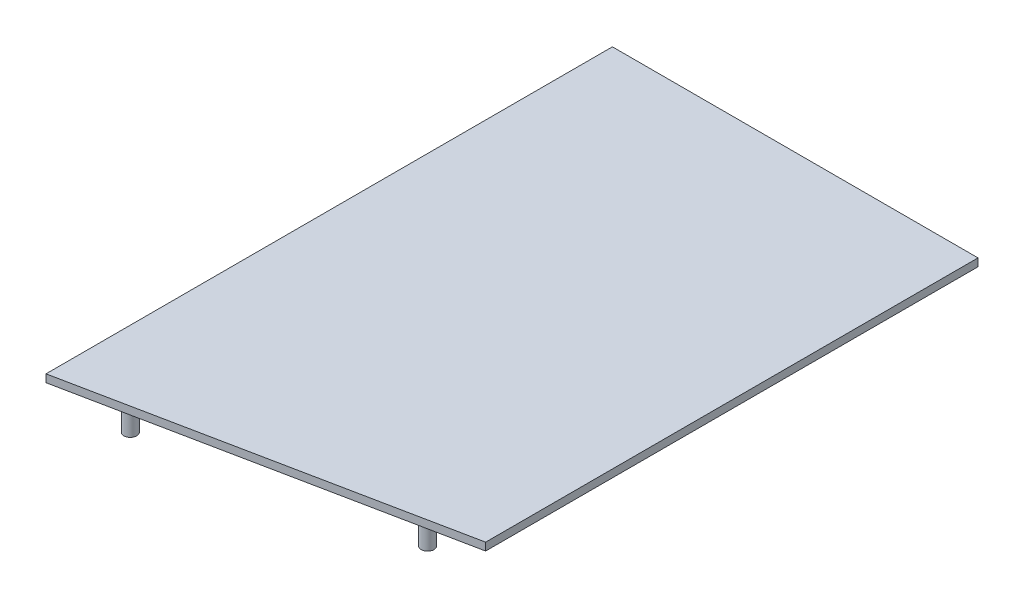
ISO-10303-21;
HEADER;
FILE_DESCRIPTION(('STEP AP214'),'2;1');
FILE_NAME('part.step','',(''),(''),'','','');
FILE_SCHEMA(('AUTOMOTIVE_DESIGN { 1 0 10303 214 1 1 1 1 }'));
ENDSEC;
DATA;
#1=APPLICATION_CONTEXT('core data for automotive mechanical design processes');
#2=APPLICATION_PROTOCOL_DEFINITION('international standard','automotive_design',2000,#1);
#3=PRODUCT_CONTEXT('',#1,'mechanical');
#4=PRODUCT('Part','Part','',(#3));
#5=PRODUCT_RELATED_PRODUCT_CATEGORY('part','',(#4));
#6=PRODUCT_DEFINITION_FORMATION('','',#4);
#7=PRODUCT_DEFINITION_CONTEXT('part definition',#1,'design');
#8=PRODUCT_DEFINITION('design','',#6,#7);
#9=PRODUCT_DEFINITION_SHAPE('','',#8);
#10=(LENGTH_UNIT() NAMED_UNIT(*) SI_UNIT(.MILLI.,.METRE.));
#11=(NAMED_UNIT(*) PLANE_ANGLE_UNIT() SI_UNIT($,.RADIAN.));
#12=(NAMED_UNIT(*) SI_UNIT($,.STERADIAN.) SOLID_ANGLE_UNIT());
#13=UNCERTAINTY_MEASURE_WITH_UNIT(LENGTH_MEASURE(1.E-05),#10,'distance_accuracy_value','');
#14=(GEOMETRIC_REPRESENTATION_CONTEXT(3) GLOBAL_UNCERTAINTY_ASSIGNED_CONTEXT((#13)) GLOBAL_UNIT_ASSIGNED_CONTEXT((#10,
#11,#12)) REPRESENTATION_CONTEXT('',''));
#15=CARTESIAN_POINT('',(0.,0.,0.));
#16=DIRECTION('',(0.,0.,1.));
#17=DIRECTION('',(1.,0.,0.));
#18=AXIS2_PLACEMENT_3D('',#15,#16,#17);
#19=CARTESIAN_POINT('',(0.,1.5,0.));
#20=DIRECTION('',(1.,0.,0.));
#21=DIRECTION('',(0.,0.,-1.));
#22=AXIS2_PLACEMENT_3D('',#19,#20,#21);
#23=PLANE('',#22);
#24=DIRECTION('',(0.,0.,1.));
#25=VECTOR('',#24,1.);
#26=CARTESIAN_POINT('',(0.,0.,0.));
#27=LINE('',#26,#25);
#28=CARTESIAN_POINT('',(0.,0.,-110.));
#29=VERTEX_POINT('',#28);
#30=CARTESIAN_POINT('',(0.,0.,0.));
#31=VERTEX_POINT('',#30);
#32=EDGE_CURVE('E181',#29,#31,#27,.T.);
#33=ORIENTED_EDGE('',*,*,#32,.T.);
#34=DIRECTION('',(0.,-1.,0.));
#35=VECTOR('',#34,1.);
#36=CARTESIAN_POINT('',(0.,1.5,0.));
#37=LINE('',#36,#35);
#38=CARTESIAN_POINT('',(0.,1.5,0.));
#39=VERTEX_POINT('',#38);
#40=EDGE_CURVE('E216',#39,#31,#37,.T.);
#41=ORIENTED_EDGE('',*,*,#40,.F.);
#42=DIRECTION('',(0.,0.,1.));
#43=VECTOR('',#42,1.);
#44=CARTESIAN_POINT('',(0.,1.5,0.));
#45=LINE('',#44,#43);
#46=CARTESIAN_POINT('',(0.,1.5,-110.));
#47=VERTEX_POINT('',#46);
#48=EDGE_CURVE('E190',#47,#39,#45,.T.);
#49=ORIENTED_EDGE('',*,*,#48,.F.);
#50=DIRECTION('',(0.,-1.,0.));
#51=VECTOR('',#50,1.);
#52=CARTESIAN_POINT('',(0.,1.5,-110.));
#53=LINE('',#52,#51);
#54=EDGE_CURVE('E200',#47,#29,#53,.T.);
#55=ORIENTED_EDGE('',*,*,#54,.T.);
#56=EDGE_LOOP('',(#33,#41,#49,#55));
#57=FACE_BOUND('',#56,.T.);
#58=ADVANCED_FACE('F33',(#57),#23,.F.);
#59=CARTESIAN_POINT('',(0.,1.5,0.));
#60=DIRECTION('',(-0.198504745678867,0.,-0.980099926509011));
#61=DIRECTION('',(-0.980099926509011,0.,0.198504745678867));
#62=AXIS2_PLACEMENT_3D('',#59,#60,#61);
#63=PLANE('',#62);
#64=DIRECTION('',(0.980099926509011,0.,-0.198504745678867));
#65=VECTOR('',#64,1.);
#66=CARTESIAN_POINT('',(0.,0.,0.));
#67=LINE('',#66,#65);
#68=CARTESIAN_POINT('',(71.,0.,-14.38));
#69=VERTEX_POINT('',#68);
#70=EDGE_CURVE('E203',#31,#69,#67,.T.);
#71=ORIENTED_EDGE('',*,*,#70,.T.);
#72=DIRECTION('',(0.,-1.,0.));
#73=VECTOR('',#72,1.);
#74=CARTESIAN_POINT('',(71.,1.5,-14.38));
#75=LINE('',#74,#73);
#76=CARTESIAN_POINT('',(71.,1.5,-14.38));
#77=VERTEX_POINT('',#76);
#78=EDGE_CURVE('E213',#77,#69,#75,.T.);
#79=ORIENTED_EDGE('',*,*,#78,.F.);
#80=DIRECTION('',(0.980099926509011,0.,-0.198504745678867));
#81=VECTOR('',#80,1.);
#82=CARTESIAN_POINT('',(0.,1.5,0.));
#83=LINE('',#82,#81);
#84=EDGE_CURVE('E193',#39,#77,#83,.T.);
#85=ORIENTED_EDGE('',*,*,#84,.F.);
#86=ORIENTED_EDGE('',*,*,#40,.T.);
#87=EDGE_LOOP('',(#71,#79,#85,#86));
#88=FACE_BOUND('',#87,.T.);
#89=ADVANCED_FACE('F256',(#88),#63,.F.);
#90=CARTESIAN_POINT('',(71.,1.5,-14.38));
#91=DIRECTION('',(-1.,0.,0.));
#92=DIRECTION('',(0.,0.,1.));
#93=AXIS2_PLACEMENT_3D('',#90,#91,#92);
#94=PLANE('',#93);
#95=DIRECTION('',(0.,0.,-1.));
#96=VECTOR('',#95,1.);
#97=CARTESIAN_POINT('',(71.,0.,-14.38));
#98=LINE('',#97,#96);
#99=CARTESIAN_POINT('',(71.,0.,-110.));
#100=VERTEX_POINT('',#99);
#101=EDGE_CURVE('E205',#69,#100,#98,.T.);
#102=ORIENTED_EDGE('',*,*,#101,.T.);
#103=DIRECTION('',(0.,-1.,0.));
#104=VECTOR('',#103,1.);
#105=CARTESIAN_POINT('',(71.,1.5,-110.));
#106=LINE('',#105,#104);
#107=CARTESIAN_POINT('',(71.,1.5,-110.));
#108=VERTEX_POINT('',#107);
#109=EDGE_CURVE('E210',#108,#100,#106,.T.);
#110=ORIENTED_EDGE('',*,*,#109,.F.);
#111=DIRECTION('',(0.,0.,-1.));
#112=VECTOR('',#111,1.);
#113=CARTESIAN_POINT('',(71.,1.5,-14.38));
#114=LINE('',#113,#112);
#115=EDGE_CURVE('E196',#77,#108,#114,.T.);
#116=ORIENTED_EDGE('',*,*,#115,.F.);
#117=ORIENTED_EDGE('',*,*,#78,.T.);
#118=EDGE_LOOP('',(#102,#110,#116,#117));
#119=FACE_BOUND('',#118,.T.);
#120=ADVANCED_FACE('F253',(#119),#94,.F.);
#121=CARTESIAN_POINT('',(0.,1.5,-110.));
#122=DIRECTION('',(0.,0.,1.));
#123=DIRECTION('',(1.,0.,0.));
#124=AXIS2_PLACEMENT_3D('',#121,#122,#123);
#125=PLANE('',#124);
#126=DIRECTION('',(-1.,0.,0.));
#127=VECTOR('',#126,1.);
#128=CARTESIAN_POINT('',(0.,0.,-110.));
#129=LINE('',#128,#127);
#130=EDGE_CURVE('E194',#100,#29,#129,.T.);
#131=ORIENTED_EDGE('',*,*,#130,.T.);
#132=ORIENTED_EDGE('',*,*,#54,.F.);
#133=DIRECTION('',(-1.,0.,0.));
#134=VECTOR('',#133,1.);
#135=CARTESIAN_POINT('',(0.,1.5,-110.));
#136=LINE('',#135,#134);
#137=EDGE_CURVE('E198',#108,#47,#136,.T.);
#138=ORIENTED_EDGE('',*,*,#137,.F.);
#139=ORIENTED_EDGE('',*,*,#109,.T.);
#140=EDGE_LOOP('',(#131,#132,#138,#139));
#141=FACE_BOUND('',#140,.T.);
#142=ADVANCED_FACE('F249',(#141),#125,.F.);
#143=CARTESIAN_POINT('',(0.,1.5,0.));
#144=DIRECTION('',(0.,-1.,0.));
#145=DIRECTION('',(0.,0.,-1.));
#146=AXIS2_PLACEMENT_3D('',#143,#144,#145);
#147=PLANE('',#146);
#148=ORIENTED_EDGE('',*,*,#48,.T.);
#149=ORIENTED_EDGE('',*,*,#84,.T.);
#150=ORIENTED_EDGE('',*,*,#115,.T.);
#151=ORIENTED_EDGE('',*,*,#137,.T.);
#152=EDGE_LOOP('',(#148,#149,#150,#151));
#153=FACE_BOUND('',#152,.T.);
#154=ADVANCED_FACE('F236',(#153),#147,.F.);
#155=CARTESIAN_POINT('',(0.,0.,0.));
#156=DIRECTION('',(0.,-1.,0.));
#157=DIRECTION('',(0.,0.,-1.));
#158=AXIS2_PLACEMENT_3D('',#155,#156,#157);
#159=PLANE('',#158);
#160=DIRECTION('',(1.,0.,0.));
#161=VECTOR('',#160,1.);
#162=CARTESIAN_POINT('',(66.,0.,-105.));
#163=LINE('',#162,#161);
#164=CARTESIAN_POINT('',(5.,0.,-105.));
#165=VERTEX_POINT('',#164);
#166=CARTESIAN_POINT('',(66.,0.,-105.));
#167=VERTEX_POINT('',#166);
#168=EDGE_CURVE('E47',#165,#167,#163,.T.);
#169=ORIENTED_EDGE('',*,*,#168,.F.);
#170=DIRECTION('',(0.,0.,-1.));
#171=VECTOR('',#170,1.);
#172=CARTESIAN_POINT('',(5.,0.,-6.11419669190154));
#173=LINE('',#172,#171);
#174=CARTESIAN_POINT('',(5.,0.,-6.11419669190154));
#175=VERTEX_POINT('',#174);
#176=EDGE_CURVE('E141',#175,#165,#173,.T.);
#177=ORIENTED_EDGE('',*,*,#176,.F.);
#178=DIRECTION('',(-0.980099926509011,0.,0.198504745678867));
#179=VECTOR('',#178,1.);
#180=CARTESIAN_POINT('',(66.,0.,-18.4688445792255));
#181=LINE('',#180,#179);
#182=CARTESIAN_POINT('',(66.,0.,-18.4688445792255));
#183=VERTEX_POINT('',#182);
#184=EDGE_CURVE('E144',#183,#175,#181,.T.);
#185=ORIENTED_EDGE('',*,*,#184,.F.);
#186=DIRECTION('',(0.,0.,1.));
#187=VECTOR('',#186,1.);
#188=CARTESIAN_POINT('',(66.,0.,-105.));
#189=LINE('',#188,#187);
#190=EDGE_CURVE('E150',#167,#183,#189,.T.);
#191=ORIENTED_EDGE('',*,*,#190,.F.);
#192=EDGE_LOOP('',(#169,#177,#185,#191));
#193=FACE_BOUND('',#192,.T.);
#194=CARTESIAN_POINT('',(59.5,0.,-14.6016053882043));
#195=DIRECTION('',(0.,-1.,0.));
#196=DIRECTION('',(0.,0.,-1.));
#197=AXIS2_PLACEMENT_3D('',#194,#195,#196);
#198=CIRCLE('',#197,1.25);
#199=CARTESIAN_POINT('',(59.5,0.,-13.3516053882043));
#200=VERTEX_POINT('',#199);
#201=EDGE_CURVE('E11',#200,#200,#198,.T.);
#202=ORIENTED_EDGE('',*,*,#201,.F.);
#203=EDGE_LOOP('',(#202));
#204=FACE_BOUND('',#203,.T.);
#205=CARTESIAN_POINT('',(11.5,0.,-4.87991524735922));
#206=DIRECTION('',(0.,-1.,0.));
#207=DIRECTION('',(0.,0.,-1.));
#208=AXIS2_PLACEMENT_3D('',#205,#206,#207);
#209=CIRCLE('',#208,1.25);
#210=CARTESIAN_POINT('',(11.5,0.,-3.62991524735922));
#211=VERTEX_POINT('',#210);
#212=EDGE_CURVE('E40',#211,#211,#209,.T.);
#213=ORIENTED_EDGE('',*,*,#212,.F.);
#214=EDGE_LOOP('',(#213));
#215=FACE_BOUND('',#214,.T.);
#216=DIRECTION('',(0.,0.,-1.));
#217=VECTOR('',#216,1.);
#218=CARTESIAN_POINT('',(10.,0.,0.));
#219=LINE('',#218,#217);
#220=CARTESIAN_POINT('',(10.,0.,-106.25));
#221=VERTEX_POINT('',#220);
#222=CARTESIAN_POINT('',(10.,0.,-108.75));
#223=VERTEX_POINT('',#222);
#224=EDGE_CURVE('E226',#221,#223,#219,.T.);
#225=ORIENTED_EDGE('',*,*,#224,.F.);
#226=DIRECTION('',(-1.,0.,0.));
#227=VECTOR('',#226,1.);
#228=CARTESIAN_POINT('',(0.,0.,-106.25));
#229=LINE('',#228,#227);
#230=CARTESIAN_POINT('',(12.5,0.,-106.25));
#231=VERTEX_POINT('',#230);
#232=EDGE_CURVE('E219',#231,#221,#229,.T.);
#233=ORIENTED_EDGE('',*,*,#232,.F.);
#234=DIRECTION('',(0.,0.,1.));
#235=VECTOR('',#234,1.);
#236=CARTESIAN_POINT('',(12.5,0.,0.));
#237=LINE('',#236,#235);
#238=CARTESIAN_POINT('',(12.5,0.,-108.75));
#239=VERTEX_POINT('',#238);
#240=EDGE_CURVE('E222',#239,#231,#237,.T.);
#241=ORIENTED_EDGE('',*,*,#240,.F.);
#242=DIRECTION('',(1.,0.,0.));
#243=VECTOR('',#242,1.);
#244=CARTESIAN_POINT('',(0.,0.,-108.75));
#245=LINE('',#244,#243);
#246=EDGE_CURVE('E55',#223,#239,#245,.T.);
#247=ORIENTED_EDGE('',*,*,#246,.F.);
#248=EDGE_LOOP('',(#225,#233,#241,#247));
#249=FACE_BOUND('',#248,.T.);
#250=ORIENTED_EDGE('',*,*,#32,.F.);
#251=ORIENTED_EDGE('',*,*,#130,.F.);
#252=ORIENTED_EDGE('',*,*,#101,.F.);
#253=ORIENTED_EDGE('',*,*,#70,.F.);
#254=EDGE_LOOP('',(#250,#251,#252,#253));
#255=FACE_BOUND('',#254,.T.);
#256=ADVANCED_FACE('F233',(#193,#204,#215,#249,#255),#159,.T.);
#257=CARTESIAN_POINT('',(10.,-5.,-108.75));
#258=DIRECTION('',(-1.,0.,0.));
#259=DIRECTION('',(0.,0.,1.));
#260=AXIS2_PLACEMENT_3D('',#257,#258,#259);
#261=PLANE('',#260);
#262=DIRECTION('',(0.,1.,0.));
#263=VECTOR('',#262,1.);
#264=CARTESIAN_POINT('',(10.,-5.,-106.25));
#265=LINE('',#264,#263);
#266=CARTESIAN_POINT('',(10.,-5.,-106.25));
#267=VERTEX_POINT('',#266);
#268=EDGE_CURVE('E177',#267,#221,#265,.T.);
#269=ORIENTED_EDGE('',*,*,#268,.T.);
#270=ORIENTED_EDGE('',*,*,#224,.T.);
#271=DIRECTION('',(0.,1.,0.));
#272=VECTOR('',#271,1.);
#273=CARTESIAN_POINT('',(10.,-5.,-108.75));
#274=LINE('',#273,#272);
#275=CARTESIAN_POINT('',(10.,-5.,-108.75));
#276=VERTEX_POINT('',#275);
#277=EDGE_CURVE('E178',#276,#223,#274,.T.);
#278=ORIENTED_EDGE('',*,*,#277,.F.);
#279=DIRECTION('',(0.,0.,1.));
#280=VECTOR('',#279,1.);
#281=CARTESIAN_POINT('',(10.,-5.,-108.75));
#282=LINE('',#281,#280);
#283=EDGE_CURVE('E165',#276,#267,#282,.T.);
#284=ORIENTED_EDGE('',*,*,#283,.T.);
#285=EDGE_LOOP('',(#269,#270,#278,#284));
#286=FACE_BOUND('',#285,.T.);
#287=ADVANCED_FACE('F235',(#286),#261,.T.);
#288=CARTESIAN_POINT('',(10.,-5.,-108.75));
#289=DIRECTION('',(0.,0.,-1.));
#290=DIRECTION('',(-1.,0.,0.));
#291=AXIS2_PLACEMENT_3D('',#288,#289,#290);
#292=PLANE('',#291);
#293=ORIENTED_EDGE('',*,*,#277,.T.);
#294=ORIENTED_EDGE('',*,*,#246,.T.);
#295=DIRECTION('',(0.,1.,0.));
#296=VECTOR('',#295,1.);
#297=CARTESIAN_POINT('',(12.5,-5.,-108.75));
#298=LINE('',#297,#296);
#299=CARTESIAN_POINT('',(12.5,-5.,-108.75));
#300=VERTEX_POINT('',#299);
#301=EDGE_CURVE('E182',#300,#239,#298,.T.);
#302=ORIENTED_EDGE('',*,*,#301,.F.);
#303=DIRECTION('',(-1.,0.,0.));
#304=VECTOR('',#303,1.);
#305=CARTESIAN_POINT('',(10.,-5.,-108.75));
#306=LINE('',#305,#304);
#307=EDGE_CURVE('E174',#300,#276,#306,.T.);
#308=ORIENTED_EDGE('',*,*,#307,.T.);
#309=EDGE_LOOP('',(#293,#294,#302,#308));
#310=FACE_BOUND('',#309,.T.);
#311=ADVANCED_FACE('F293',(#310),#292,.T.);
#312=CARTESIAN_POINT('',(12.5,-5.,-108.75));
#313=DIRECTION('',(1.,0.,0.));
#314=DIRECTION('',(0.,0.,-1.));
#315=AXIS2_PLACEMENT_3D('',#312,#313,#314);
#316=PLANE('',#315);
#317=ORIENTED_EDGE('',*,*,#301,.T.);
#318=ORIENTED_EDGE('',*,*,#240,.T.);
#319=DIRECTION('',(0.,1.,0.));
#320=VECTOR('',#319,1.);
#321=CARTESIAN_POINT('',(12.5,-5.,-106.25));
#322=LINE('',#321,#320);
#323=CARTESIAN_POINT('',(12.5,-5.,-106.25));
#324=VERTEX_POINT('',#323);
#325=EDGE_CURVE('E185',#324,#231,#322,.T.);
#326=ORIENTED_EDGE('',*,*,#325,.F.);
#327=DIRECTION('',(0.,0.,-1.));
#328=VECTOR('',#327,1.);
#329=CARTESIAN_POINT('',(12.5,-5.,-108.75));
#330=LINE('',#329,#328);
#331=EDGE_CURVE('E171',#324,#300,#330,.T.);
#332=ORIENTED_EDGE('',*,*,#331,.T.);
#333=EDGE_LOOP('',(#317,#318,#326,#332));
#334=FACE_BOUND('',#333,.T.);
#335=ADVANCED_FACE('F302',(#334),#316,.T.);
#336=CARTESIAN_POINT('',(10.,-5.,-106.25));
#337=DIRECTION('',(0.,0.,1.));
#338=DIRECTION('',(1.,0.,0.));
#339=AXIS2_PLACEMENT_3D('',#336,#337,#338);
#340=PLANE('',#339);
#341=ORIENTED_EDGE('',*,*,#325,.T.);
#342=ORIENTED_EDGE('',*,*,#232,.T.);
#343=ORIENTED_EDGE('',*,*,#268,.F.);
#344=DIRECTION('',(1.,0.,0.));
#345=VECTOR('',#344,1.);
#346=CARTESIAN_POINT('',(10.,-5.,-106.25));
#347=LINE('',#346,#345);
#348=EDGE_CURVE('E168',#267,#324,#347,.T.);
#349=ORIENTED_EDGE('',*,*,#348,.T.);
#350=EDGE_LOOP('',(#341,#342,#343,#349));
#351=FACE_BOUND('',#350,.T.);
#352=ADVANCED_FACE('F312',(#351),#340,.T.);
#353=CARTESIAN_POINT('',(0.,-5.,0.));
#354=DIRECTION('',(0.,1.,0.));
#355=DIRECTION('',(0.,0.,1.));
#356=AXIS2_PLACEMENT_3D('',#353,#354,#355);
#357=PLANE('',#356);
#358=ORIENTED_EDGE('',*,*,#283,.F.);
#359=ORIENTED_EDGE('',*,*,#307,.F.);
#360=ORIENTED_EDGE('',*,*,#331,.F.);
#361=ORIENTED_EDGE('',*,*,#348,.F.);
#362=EDGE_LOOP('',(#358,#359,#360,#361));
#363=FACE_BOUND('',#362,.T.);
#364=ADVANCED_FACE('F322',(#363),#357,.F.);
#365=CARTESIAN_POINT('',(11.5,-5.,-4.87991524735922));
#366=DIRECTION('',(0.,1.,0.));
#367=DIRECTION('',(0.,0.,1.));
#368=AXIS2_PLACEMENT_3D('',#365,#366,#367);
#369=CYLINDRICAL_SURFACE('',#368,1.25);
#370=CARTESIAN_POINT('',(11.5,-5.,-4.87991524735922));
#371=DIRECTION('',(0.,1.,0.));
#372=DIRECTION('',(0.,0.,1.));
#373=AXIS2_PLACEMENT_3D('',#370,#371,#372);
#374=CIRCLE('',#373,1.25);
#375=CARTESIAN_POINT('',(11.5,-5.,-3.62991524735922));
#376=VERTEX_POINT('',#375);
#377=EDGE_CURVE('E162',#376,#376,#374,.T.);
#378=CARTESIAN_POINT('',(11.5,0.,-3.62991524735922));
#379=CARTESIAN_POINT('',(11.5,-0.0520833333333325,-3.62991524735922));
#380=CARTESIAN_POINT('',(11.5,-0.104166666666666,-3.62991524735922));
#381=CARTESIAN_POINT('',(11.5,-0.208333333333333,-3.62991524735922));
#382=CARTESIAN_POINT('',(11.5,-0.260416666666666,-3.62991524735922));
#383=CARTESIAN_POINT('',(11.5,-0.364583333333333,-3.62991524735922));
#384=CARTESIAN_POINT('',(11.5,-0.416666666666666,-3.62991524735922));
#385=CARTESIAN_POINT('',(11.5,-0.520833333333333,-3.62991524735922));
#386=CARTESIAN_POINT('',(11.5,-0.572916666666666,-3.62991524735922));
#387=CARTESIAN_POINT('',(11.5,-0.677083333333333,-3.62991524735922));
#388=CARTESIAN_POINT('',(11.5,-0.729166666666666,-3.62991524735922));
#389=CARTESIAN_POINT('',(11.5,-0.833333333333332,-3.62991524735922));
#390=CARTESIAN_POINT('',(11.5,-0.885416666666666,-3.62991524735922));
#391=CARTESIAN_POINT('',(11.5,-0.989583333333333,-3.62991524735922));
#392=CARTESIAN_POINT('',(11.5,-1.04166666666667,-3.62991524735922));
#393=CARTESIAN_POINT('',(11.5,-1.14583333333333,-3.62991524735922));
#394=CARTESIAN_POINT('',(11.5,-1.19791666666667,-3.62991524735922));
#395=CARTESIAN_POINT('',(11.5,-1.30208333333333,-3.62991524735922));
#396=CARTESIAN_POINT('',(11.5,-1.35416666666667,-3.62991524735922));
#397=CARTESIAN_POINT('',(11.5,-1.45833333333333,-3.62991524735922));
#398=CARTESIAN_POINT('',(11.5,-1.51041666666667,-3.62991524735922));
#399=CARTESIAN_POINT('',(11.5,-1.61458333333333,-3.62991524735922));
#400=CARTESIAN_POINT('',(11.5,-1.66666666666667,-3.62991524735922));
#401=CARTESIAN_POINT('',(11.5,-1.77083333333333,-3.62991524735922));
#402=CARTESIAN_POINT('',(11.5,-1.82291666666667,-3.62991524735922));
#403=CARTESIAN_POINT('',(11.5,-1.92708333333333,-3.62991524735922));
#404=CARTESIAN_POINT('',(11.5,-1.97916666666667,-3.62991524735922));
#405=CARTESIAN_POINT('',(11.5,-2.08333333333333,-3.62991524735922));
#406=CARTESIAN_POINT('',(11.5,-2.13541666666667,-3.62991524735922));
#407=CARTESIAN_POINT('',(11.5,-2.23958333333333,-3.62991524735922));
#408=CARTESIAN_POINT('',(11.5,-2.29166666666667,-3.62991524735922));
#409=CARTESIAN_POINT('',(11.5,-2.39583333333333,-3.62991524735922));
#410=CARTESIAN_POINT('',(11.5,-2.44791666666667,-3.62991524735922));
#411=CARTESIAN_POINT('',(11.5,-2.55208333333333,-3.62991524735922));
#412=CARTESIAN_POINT('',(11.5,-2.60416666666667,-3.62991524735922));
#413=CARTESIAN_POINT('',(11.5,-2.70833333333333,-3.62991524735922));
#414=CARTESIAN_POINT('',(11.5,-2.76041666666667,-3.62991524735922));
#415=CARTESIAN_POINT('',(11.5,-2.86458333333333,-3.62991524735922));
#416=CARTESIAN_POINT('',(11.5,-2.91666666666667,-3.62991524735922));
#417=CARTESIAN_POINT('',(11.5,-3.02083333333333,-3.62991524735922));
#418=CARTESIAN_POINT('',(11.5,-3.07291666666667,-3.62991524735922));
#419=CARTESIAN_POINT('',(11.5,-3.17708333333333,-3.62991524735922));
#420=CARTESIAN_POINT('',(11.5,-3.22916666666667,-3.62991524735922));
#421=CARTESIAN_POINT('',(11.5,-3.33333333333333,-3.62991524735922));
#422=CARTESIAN_POINT('',(11.5,-3.38541666666667,-3.62991524735922));
#423=CARTESIAN_POINT('',(11.5,-3.48958333333333,-3.62991524735922));
#424=CARTESIAN_POINT('',(11.5,-3.54166666666667,-3.62991524735922));
#425=CARTESIAN_POINT('',(11.5,-3.64583333333333,-3.62991524735922));
#426=CARTESIAN_POINT('',(11.5,-3.69791666666667,-3.62991524735922));
#427=CARTESIAN_POINT('',(11.5,-3.80208333333333,-3.62991524735922));
#428=CARTESIAN_POINT('',(11.5,-3.85416666666667,-3.62991524735922));
#429=CARTESIAN_POINT('',(11.5,-3.95833333333333,-3.62991524735922));
#430=CARTESIAN_POINT('',(11.5,-4.01041666666667,-3.62991524735922));
#431=CARTESIAN_POINT('',(11.5,-4.11458333333333,-3.62991524735922));
#432=CARTESIAN_POINT('',(11.5,-4.16666666666667,-3.62991524735922));
#433=CARTESIAN_POINT('',(11.5,-4.27083333333333,-3.62991524735922));
#434=CARTESIAN_POINT('',(11.5,-4.32291666666667,-3.62991524735922));
#435=CARTESIAN_POINT('',(11.5,-4.42708333333333,-3.62991524735922));
#436=CARTESIAN_POINT('',(11.5,-4.47916666666667,-3.62991524735922));
#437=CARTESIAN_POINT('',(11.5,-4.58333333333333,-3.62991524735922));
#438=CARTESIAN_POINT('',(11.5,-4.63541666666667,-3.62991524735922));
#439=CARTESIAN_POINT('',(11.5,-4.73958333333333,-3.62991524735922));
#440=CARTESIAN_POINT('',(11.5,-4.79166666666667,-3.62991524735922));
#441=CARTESIAN_POINT('',(11.5,-4.89583333333333,-3.62991524735922));
#442=CARTESIAN_POINT('',(11.5,-4.94791666666667,-3.62991524735922));
#443=CARTESIAN_POINT('',(11.5,-5.,-3.62991524735922));
#444=B_SPLINE_CURVE_WITH_KNOTS('',3,(#378,#379,#380,#381,#382,#383,#384,#385,#386,#387,#388,
#389,#390,#391,#392,#393,#394,#395,#396,#397,#398,#399,#400,#401,#402,#403,#404,#405,#406,#407,
#408,#409,#410,#411,#412,#413,#414,#415,#416,#417,#418,#419,#420,#421,#422,#423,#424,#425,#426,
#427,#428,#429,#430,#431,#432,#433,#434,#435,#436,#437,#438,#439,#440,#441,#442,#443),
.UNSPECIFIED.,.F.,.F.,(4,2,2,2,2,2,2,2,2,2,2,2,2,2,2,2,2,2,2,2,2,2,2,2,2,2,2,2,2,2,2,2,4),(0.,
0.15625,0.3125,0.46875,0.625000000000001,0.78125,0.9375,1.09375,1.25,1.40625,1.5625,1.71875,
1.875,2.03125,2.1875,2.34375,2.5,2.65625,2.8125,2.96875,3.125,3.28125,3.4375,3.59375,3.75,
3.90625,4.0625,4.21875,4.375,4.53125,4.6875,4.84375,5.),.UNSPECIFIED.);
#445=EDGE_CURVE('BSEAM230',#211,#376,#444,.T.);
#446=ORIENTED_EDGE('',*,*,#212,.T.);
#447=ORIENTED_EDGE('',*,*,#377,.T.);
#448=ORIENTED_EDGE('',*,*,#445,.T.);
#449=ORIENTED_EDGE('',*,*,#445,.F.);
#450=EDGE_LOOP('',(#446,#448,#447,#449));
#451=FACE_BOUND('',#450,.T.);
#452=ADVANCED_FACE('F230',(#451),#369,.T.);
#453=CARTESIAN_POINT('',(11.5,-5.,-4.87991524735922));
#454=DIRECTION('',(0.,1.,0.));
#455=DIRECTION('',(0.,0.,1.));
#456=AXIS2_PLACEMENT_3D('',#453,#454,#455);
#457=PLANE('',#456);
#458=ORIENTED_EDGE('',*,*,#377,.F.);
#459=EDGE_LOOP('',(#458));
#460=FACE_BOUND('',#459,.T.);
#461=ADVANCED_FACE('F341',(#460),#457,.F.);
#462=CARTESIAN_POINT('',(59.5,-5.,-14.6016053882043));
#463=DIRECTION('',(0.,1.,0.));
#464=DIRECTION('',(0.,0.,1.));
#465=AXIS2_PLACEMENT_3D('',#462,#463,#464);
#466=CYLINDRICAL_SURFACE('',#465,1.25);
#467=CARTESIAN_POINT('',(59.5,-5.,-14.6016053882043));
#468=DIRECTION('',(0.,1.,0.));
#469=DIRECTION('',(0.,0.,1.));
#470=AXIS2_PLACEMENT_3D('',#467,#468,#469);
#471=CIRCLE('',#470,1.25);
#472=CARTESIAN_POINT('',(59.5,-5.,-13.3516053882043));
#473=VERTEX_POINT('',#472);
#474=EDGE_CURVE('E156',#473,#473,#471,.T.);
#475=CARTESIAN_POINT('',(59.5,0.,-13.3516053882043));
#476=CARTESIAN_POINT('',(59.5,-0.0520833333333325,-13.3516053882043));
#477=CARTESIAN_POINT('',(59.5,-0.104166666666666,-13.3516053882043));
#478=CARTESIAN_POINT('',(59.5,-0.208333333333333,-13.3516053882043));
#479=CARTESIAN_POINT('',(59.5,-0.260416666666666,-13.3516053882043));
#480=CARTESIAN_POINT('',(59.5,-0.364583333333333,-13.3516053882043));
#481=CARTESIAN_POINT('',(59.5,-0.416666666666666,-13.3516053882043));
#482=CARTESIAN_POINT('',(59.5,-0.520833333333333,-13.3516053882043));
#483=CARTESIAN_POINT('',(59.5,-0.572916666666666,-13.3516053882043));
#484=CARTESIAN_POINT('',(59.5,-0.677083333333333,-13.3516053882043));
#485=CARTESIAN_POINT('',(59.5,-0.729166666666666,-13.3516053882043));
#486=CARTESIAN_POINT('',(59.5,-0.833333333333332,-13.3516053882043));
#487=CARTESIAN_POINT('',(59.5,-0.885416666666666,-13.3516053882043));
#488=CARTESIAN_POINT('',(59.5,-0.989583333333333,-13.3516053882043));
#489=CARTESIAN_POINT('',(59.5,-1.04166666666667,-13.3516053882043));
#490=CARTESIAN_POINT('',(59.5,-1.14583333333333,-13.3516053882043));
#491=CARTESIAN_POINT('',(59.5,-1.19791666666667,-13.3516053882043));
#492=CARTESIAN_POINT('',(59.5,-1.30208333333333,-13.3516053882043));
#493=CARTESIAN_POINT('',(59.5,-1.35416666666667,-13.3516053882043));
#494=CARTESIAN_POINT('',(59.5,-1.45833333333333,-13.3516053882043));
#495=CARTESIAN_POINT('',(59.5,-1.51041666666667,-13.3516053882043));
#496=CARTESIAN_POINT('',(59.5,-1.61458333333333,-13.3516053882043));
#497=CARTESIAN_POINT('',(59.5,-1.66666666666667,-13.3516053882043));
#498=CARTESIAN_POINT('',(59.5,-1.77083333333333,-13.3516053882043));
#499=CARTESIAN_POINT('',(59.5,-1.82291666666667,-13.3516053882043));
#500=CARTESIAN_POINT('',(59.5,-1.92708333333333,-13.3516053882043));
#501=CARTESIAN_POINT('',(59.5,-1.97916666666667,-13.3516053882043));
#502=CARTESIAN_POINT('',(59.5,-2.08333333333333,-13.3516053882043));
#503=CARTESIAN_POINT('',(59.5,-2.13541666666667,-13.3516053882043));
#504=CARTESIAN_POINT('',(59.5,-2.23958333333333,-13.3516053882043));
#505=CARTESIAN_POINT('',(59.5,-2.29166666666667,-13.3516053882043));
#506=CARTESIAN_POINT('',(59.5,-2.39583333333333,-13.3516053882043));
#507=CARTESIAN_POINT('',(59.5,-2.44791666666667,-13.3516053882043));
#508=CARTESIAN_POINT('',(59.5,-2.55208333333333,-13.3516053882043));
#509=CARTESIAN_POINT('',(59.5,-2.60416666666667,-13.3516053882043));
#510=CARTESIAN_POINT('',(59.5,-2.70833333333333,-13.3516053882043));
#511=CARTESIAN_POINT('',(59.5,-2.76041666666667,-13.3516053882043));
#512=CARTESIAN_POINT('',(59.5,-2.86458333333333,-13.3516053882043));
#513=CARTESIAN_POINT('',(59.5,-2.91666666666667,-13.3516053882043));
#514=CARTESIAN_POINT('',(59.5,-3.02083333333333,-13.3516053882043));
#515=CARTESIAN_POINT('',(59.5,-3.07291666666667,-13.3516053882043));
#516=CARTESIAN_POINT('',(59.5,-3.17708333333333,-13.3516053882043));
#517=CARTESIAN_POINT('',(59.5,-3.22916666666667,-13.3516053882043));
#518=CARTESIAN_POINT('',(59.5,-3.33333333333333,-13.3516053882043));
#519=CARTESIAN_POINT('',(59.5,-3.38541666666667,-13.3516053882043));
#520=CARTESIAN_POINT('',(59.5,-3.48958333333333,-13.3516053882043));
#521=CARTESIAN_POINT('',(59.5,-3.54166666666667,-13.3516053882043));
#522=CARTESIAN_POINT('',(59.5,-3.64583333333333,-13.3516053882043));
#523=CARTESIAN_POINT('',(59.5,-3.69791666666667,-13.3516053882043));
#524=CARTESIAN_POINT('',(59.5,-3.80208333333333,-13.3516053882043));
#525=CARTESIAN_POINT('',(59.5,-3.85416666666667,-13.3516053882043));
#526=CARTESIAN_POINT('',(59.5,-3.95833333333333,-13.3516053882043));
#527=CARTESIAN_POINT('',(59.5,-4.01041666666667,-13.3516053882043));
#528=CARTESIAN_POINT('',(59.5,-4.11458333333333,-13.3516053882043));
#529=CARTESIAN_POINT('',(59.5,-4.16666666666667,-13.3516053882043));
#530=CARTESIAN_POINT('',(59.5,-4.27083333333333,-13.3516053882043));
#531=CARTESIAN_POINT('',(59.5,-4.32291666666667,-13.3516053882043));
#532=CARTESIAN_POINT('',(59.5,-4.42708333333333,-13.3516053882043));
#533=CARTESIAN_POINT('',(59.5,-4.47916666666667,-13.3516053882043));
#534=CARTESIAN_POINT('',(59.5,-4.58333333333333,-13.3516053882043));
#535=CARTESIAN_POINT('',(59.5,-4.63541666666667,-13.3516053882043));
#536=CARTESIAN_POINT('',(59.5,-4.73958333333333,-13.3516053882043));
#537=CARTESIAN_POINT('',(59.5,-4.79166666666667,-13.3516053882043));
#538=CARTESIAN_POINT('',(59.5,-4.89583333333333,-13.3516053882043));
#539=CARTESIAN_POINT('',(59.5,-4.94791666666667,-13.3516053882043));
#540=CARTESIAN_POINT('',(59.5,-5.,-13.3516053882043));
#541=B_SPLINE_CURVE_WITH_KNOTS('',3,(#475,#476,#477,#478,#479,#480,#481,#482,#483,#484,#485,
#486,#487,#488,#489,#490,#491,#492,#493,#494,#495,#496,#497,#498,#499,#500,#501,#502,#503,#504,
#505,#506,#507,#508,#509,#510,#511,#512,#513,#514,#515,#516,#517,#518,#519,#520,#521,#522,#523,
#524,#525,#526,#527,#528,#529,#530,#531,#532,#533,#534,#535,#536,#537,#538,#539,#540),
.UNSPECIFIED.,.F.,.F.,(4,2,2,2,2,2,2,2,2,2,2,2,2,2,2,2,2,2,2,2,2,2,2,2,2,2,2,2,2,2,2,2,4),(0.,
0.15625,0.3125,0.46875,0.625000000000001,0.78125,0.9375,1.09375,1.25,1.40625,1.5625,1.71875,
1.875,2.03125,2.1875,2.34375,2.5,2.65625,2.8125,2.96875,3.125,3.28125,3.4375,3.59375,3.75,
3.90625,4.0625,4.21875,4.375,4.53125,4.6875,4.84375,5.),.UNSPECIFIED.);
#542=EDGE_CURVE('BSEAM350',#200,#473,#541,.T.);
#543=ORIENTED_EDGE('',*,*,#201,.T.);
#544=ORIENTED_EDGE('',*,*,#474,.T.);
#545=ORIENTED_EDGE('',*,*,#542,.T.);
#546=ORIENTED_EDGE('',*,*,#542,.F.);
#547=EDGE_LOOP('',(#543,#545,#544,#546));
#548=FACE_BOUND('',#547,.T.);
#549=ADVANCED_FACE('F350',(#548),#466,.T.);
#550=CARTESIAN_POINT('',(59.5,-5.,-14.6016053882043));
#551=DIRECTION('',(0.,1.,0.));
#552=DIRECTION('',(0.,0.,1.));
#553=AXIS2_PLACEMENT_3D('',#550,#551,#552);
#554=PLANE('',#553);
#555=ORIENTED_EDGE('',*,*,#474,.F.);
#556=EDGE_LOOP('',(#555));
#557=FACE_BOUND('',#556,.T.);
#558=ADVANCED_FACE('F360',(#557),#554,.F.);
#559=CARTESIAN_POINT('',(66.,0.6,-105.));
#560=DIRECTION('',(0.,0.,-1.));
#561=DIRECTION('',(-1.,0.,0.));
#562=AXIS2_PLACEMENT_3D('',#559,#560,#561);
#563=PLANE('',#562);
#564=ORIENTED_EDGE('',*,*,#168,.T.);
#565=DIRECTION('',(0.,-1.,0.));
#566=VECTOR('',#565,1.);
#567=CARTESIAN_POINT('',(66.,0.6,-105.));
#568=LINE('',#567,#566);
#569=CARTESIAN_POINT('',(66.,0.6,-105.));
#570=VERTEX_POINT('',#569);
#571=EDGE_CURVE('E119',#570,#167,#568,.T.);
#572=ORIENTED_EDGE('',*,*,#571,.F.);
#573=DIRECTION('',(1.,0.,0.));
#574=VECTOR('',#573,1.);
#575=CARTESIAN_POINT('',(66.,0.6,-105.));
#576=LINE('',#575,#574);
#577=CARTESIAN_POINT('',(5.,0.6,-105.));
#578=VERTEX_POINT('',#577);
#579=EDGE_CURVE('E123',#578,#570,#576,.T.);
#580=ORIENTED_EDGE('',*,*,#579,.F.);
#581=DIRECTION('',(0.,-1.,0.));
#582=VECTOR('',#581,1.);
#583=CARTESIAN_POINT('',(5.,0.6,-105.));
#584=LINE('',#583,#582);
#585=EDGE_CURVE('E154',#578,#165,#584,.T.);
#586=ORIENTED_EDGE('',*,*,#585,.T.);
#587=EDGE_LOOP('',(#564,#572,#580,#586));
#588=FACE_BOUND('',#587,.T.);
#589=ADVANCED_FACE('F121',(#588),#563,.F.);
#590=CARTESIAN_POINT('',(5.,0.6,-6.11419669190154));
#591=DIRECTION('',(-1.,0.,0.));
#592=DIRECTION('',(0.,0.,1.));
#593=AXIS2_PLACEMENT_3D('',#590,#591,#592);
#594=PLANE('',#593);
#595=ORIENTED_EDGE('',*,*,#176,.T.);
#596=ORIENTED_EDGE('',*,*,#585,.F.);
#597=DIRECTION('',(0.,0.,-1.));
#598=VECTOR('',#597,1.);
#599=CARTESIAN_POINT('',(5.,0.6,-6.11419669190154));
#600=LINE('',#599,#598);
#601=CARTESIAN_POINT('',(5.,0.6,-6.11419669190154));
#602=VERTEX_POINT('',#601);
#603=EDGE_CURVE('E129',#602,#578,#600,.T.);
#604=ORIENTED_EDGE('',*,*,#603,.F.);
#605=DIRECTION('',(0.,-1.,0.));
#606=VECTOR('',#605,1.);
#607=CARTESIAN_POINT('',(5.,0.6,-6.11419669190154));
#608=LINE('',#607,#606);
#609=EDGE_CURVE('E157',#602,#175,#608,.T.);
#610=ORIENTED_EDGE('',*,*,#609,.T.);
#611=EDGE_LOOP('',(#595,#596,#604,#610));
#612=FACE_BOUND('',#611,.T.);
#613=ADVANCED_FACE('F384',(#612),#594,.F.);
#614=CARTESIAN_POINT('',(66.,0.6,-18.4688445792255));
#615=DIRECTION('',(0.198504745678867,0.,0.980099926509011));
#616=DIRECTION('',(0.980099926509011,0.,-0.198504745678867));
#617=AXIS2_PLACEMENT_3D('',#614,#615,#616);
#618=PLANE('',#617);
#619=ORIENTED_EDGE('',*,*,#184,.T.);
#620=ORIENTED_EDGE('',*,*,#609,.F.);
#621=DIRECTION('',(-0.980099926509011,0.,0.198504745678867));
#622=VECTOR('',#621,1.);
#623=CARTESIAN_POINT('',(66.,0.6,-18.4688445792255));
#624=LINE('',#623,#622);
#625=CARTESIAN_POINT('',(66.,0.6,-18.4688445792255));
#626=VERTEX_POINT('',#625);
#627=EDGE_CURVE('E137',#626,#602,#624,.T.);
#628=ORIENTED_EDGE('',*,*,#627,.F.);
#629=DIRECTION('',(0.,-1.,0.));
#630=VECTOR('',#629,1.);
#631=CARTESIAN_POINT('',(66.,0.6,-18.4688445792255));
#632=LINE('',#631,#630);
#633=EDGE_CURVE('E128',#626,#183,#632,.T.);
#634=ORIENTED_EDGE('',*,*,#633,.T.);
#635=EDGE_LOOP('',(#619,#620,#628,#634));
#636=FACE_BOUND('',#635,.T.);
#637=ADVANCED_FACE('F393',(#636),#618,.F.);
#638=CARTESIAN_POINT('',(66.,0.6,-105.));
#639=DIRECTION('',(1.,0.,0.));
#640=DIRECTION('',(0.,0.,-1.));
#641=AXIS2_PLACEMENT_3D('',#638,#639,#640);
#642=PLANE('',#641);
#643=ORIENTED_EDGE('',*,*,#190,.T.);
#644=ORIENTED_EDGE('',*,*,#633,.F.);
#645=DIRECTION('',(0.,0.,1.));
#646=VECTOR('',#645,1.);
#647=CARTESIAN_POINT('',(66.,0.6,-105.));
#648=LINE('',#647,#646);
#649=EDGE_CURVE('E132',#570,#626,#648,.T.);
#650=ORIENTED_EDGE('',*,*,#649,.F.);
#651=ORIENTED_EDGE('',*,*,#571,.T.);
#652=EDGE_LOOP('',(#643,#644,#650,#651));
#653=FACE_BOUND('',#652,.T.);
#654=ADVANCED_FACE('F133',(#653),#642,.F.);
#655=CARTESIAN_POINT('',(0.,0.6,0.));
#656=DIRECTION('',(0.,-1.,0.));
#657=DIRECTION('',(0.,0.,-1.));
#658=AXIS2_PLACEMENT_3D('',#655,#656,#657);
#659=PLANE('',#658);
#660=ORIENTED_EDGE('',*,*,#579,.T.);
#661=ORIENTED_EDGE('',*,*,#649,.T.);
#662=ORIENTED_EDGE('',*,*,#627,.T.);
#663=ORIENTED_EDGE('',*,*,#603,.T.);
#664=EDGE_LOOP('',(#660,#661,#662,#663));
#665=FACE_BOUND('',#664,.T.);
#666=ADVANCED_FACE('F139',(#665),#659,.T.);
#667=CLOSED_SHELL('',(#58,#89,#120,#142,#154,#256,#287,#311,#335,#352,#364,#452,#461,#549,#558,
#589,#613,#637,#654,#666));
#668=MANIFOLD_SOLID_BREP('B2',#667);
#669=ADVANCED_BREP_SHAPE_REPRESENTATION('',(#18,#668),#14);
#670=SHAPE_DEFINITION_REPRESENTATION(#9,#669);
ENDSEC;
END-ISO-10303-21;
